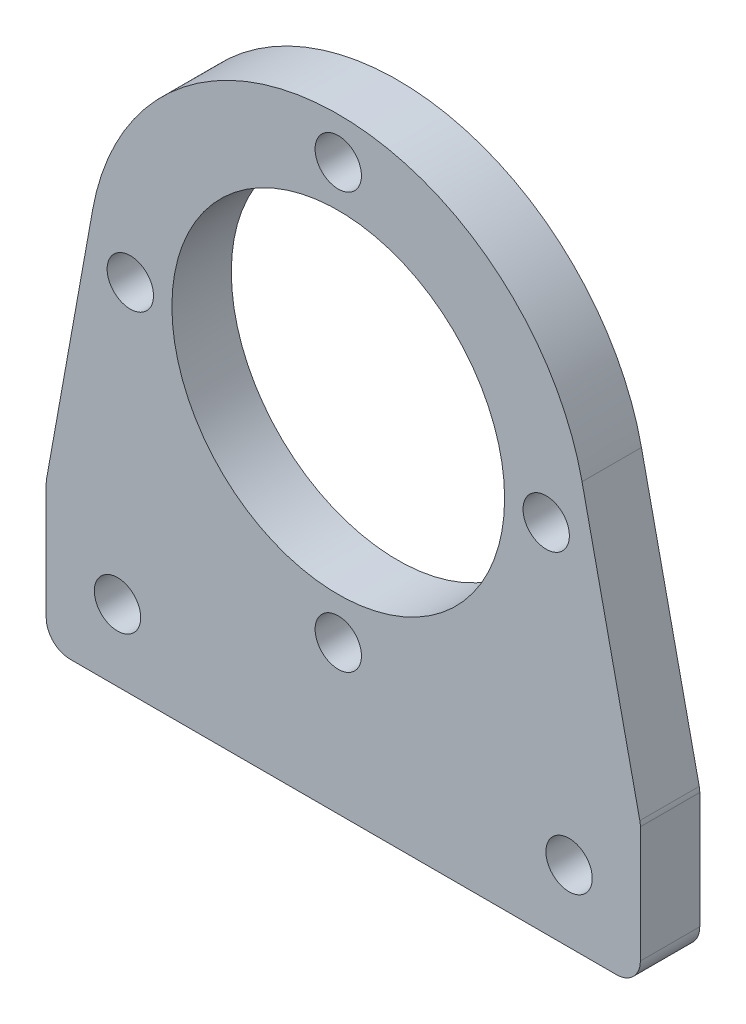
ISO-10303-21;
HEADER;
FILE_DESCRIPTION(('STEP AP214'),'2;1');
FILE_NAME('part.step','',(''),(''),'','','');
FILE_SCHEMA(('AUTOMOTIVE_DESIGN { 1 0 10303 214 1 1 1 1 }'));
ENDSEC;
DATA;
#1=APPLICATION_CONTEXT('core data for automotive mechanical design processes');
#2=APPLICATION_PROTOCOL_DEFINITION('international standard','automotive_design',2000,#1);
#3=PRODUCT_CONTEXT('',#1,'mechanical');
#4=PRODUCT('Part','Part','',(#3));
#5=PRODUCT_RELATED_PRODUCT_CATEGORY('part','',(#4));
#6=PRODUCT_DEFINITION_FORMATION('','',#4);
#7=PRODUCT_DEFINITION_CONTEXT('part definition',#1,'design');
#8=PRODUCT_DEFINITION('design','',#6,#7);
#9=PRODUCT_DEFINITION_SHAPE('','',#8);
#10=(LENGTH_UNIT() NAMED_UNIT(*) SI_UNIT(.MILLI.,.METRE.));
#11=(NAMED_UNIT(*) PLANE_ANGLE_UNIT() SI_UNIT($,.RADIAN.));
#12=(NAMED_UNIT(*) SI_UNIT($,.STERADIAN.) SOLID_ANGLE_UNIT());
#13=UNCERTAINTY_MEASURE_WITH_UNIT(LENGTH_MEASURE(1.E-05),#10,'distance_accuracy_value','');
#14=(GEOMETRIC_REPRESENTATION_CONTEXT(3) GLOBAL_UNCERTAINTY_ASSIGNED_CONTEXT((#13)) GLOBAL_UNIT_ASSIGNED_CONTEXT((#10,
#11,#12)) REPRESENTATION_CONTEXT('',''));
#15=CARTESIAN_POINT('',(0.,0.,0.));
#16=DIRECTION('',(0.,0.,1.));
#17=DIRECTION('',(1.,0.,0.));
#18=AXIS2_PLACEMENT_3D('',#15,#16,#17);
#19=CARTESIAN_POINT('',(0.,0.,5.));
#20=DIRECTION('',(0.,0.,1.));
#21=DIRECTION('',(1.,0.,0.));
#22=AXIS2_PLACEMENT_3D('',#19,#20,#21);
#23=PLANE('',#22);
#24=CARTESIAN_POINT('',(19.4243190206416,-24.,5.));
#25=DIRECTION('',(0.,0.,1.));
#26=DIRECTION('',(1.,0.,0.));
#27=AXIS2_PLACEMENT_3D('',#24,#25,#26);
#28=CIRCLE('',#27,1.95);
#29=CARTESIAN_POINT('',(21.3743190206416,-24.,5.));
#30=VERTEX_POINT('',#29);
#31=EDGE_CURVE('E250',#30,#30,#28,.T.);
#32=ORIENTED_EDGE('',*,*,#31,.F.);
#33=EDGE_LOOP('',(#32));
#34=FACE_BOUND('',#33,.T.);
#35=CARTESIAN_POINT('',(-18.5756809793584,-24.,5.));
#36=DIRECTION('',(0.,0.,1.));
#37=DIRECTION('',(1.,0.,0.));
#38=AXIS2_PLACEMENT_3D('',#35,#36,#37);
#39=CIRCLE('',#38,1.95);
#40=CARTESIAN_POINT('',(-16.6256809793584,-24.,5.));
#41=VERTEX_POINT('',#40);
#42=EDGE_CURVE('E247',#41,#41,#39,.T.);
#43=ORIENTED_EDGE('',*,*,#42,.F.);
#44=EDGE_LOOP('',(#43));
#45=FACE_BOUND('',#44,.T.);
#46=CARTESIAN_POINT('',(0.,-17.5,5.));
#47=DIRECTION('',(0.,0.,1.));
#48=DIRECTION('',(1.,0.,0.));
#49=AXIS2_PLACEMENT_3D('',#46,#47,#48);
#50=CIRCLE('',#49,1.95);
#51=CARTESIAN_POINT('',(1.95,-17.5,5.));
#52=VERTEX_POINT('',#51);
#53=EDGE_CURVE('E229',#52,#52,#50,.T.);
#54=ORIENTED_EDGE('',*,*,#53,.F.);
#55=EDGE_LOOP('',(#54));
#56=FACE_BOUND('',#55,.T.);
#57=CARTESIAN_POINT('',(0.,0.,5.));
#58=DIRECTION('',(0.,0.,1.));
#59=DIRECTION('',(1.,0.,0.));
#60=AXIS2_PLACEMENT_3D('',#57,#58,#59);
#61=CIRCLE('',#60,14.);
#62=CARTESIAN_POINT('',(14.,0.,5.));
#63=VERTEX_POINT('',#62);
#64=EDGE_CURVE('E218',#63,#63,#61,.T.);
#65=ORIENTED_EDGE('',*,*,#64,.F.);
#66=EDGE_LOOP('',(#65));
#67=FACE_BOUND('',#66,.T.);
#68=DIRECTION('',(0.,1.,0.));
#69=VECTOR('',#68,1.);
#70=CARTESIAN_POINT('',(25.4243190206416,-30.,5.));
#71=LINE('',#70,#69);
#72=CARTESIAN_POINT('',(25.4243190206416,-28.,5.));
#73=VERTEX_POINT('',#72);
#74=CARTESIAN_POINT('',(25.4243190206416,-18.2157751428587,5.));
#75=VERTEX_POINT('',#74);
#76=EDGE_CURVE('E214',#73,#75,#71,.T.);
#77=ORIENTED_EDGE('',*,*,#76,.T.);
#78=CARTESIAN_POINT('',(23.4243190206416,-18.2157751428587,5.));
#79=DIRECTION('',(0.,0.,1.));
#80=DIRECTION('',(1.,0.,0.));
#81=AXIS2_PLACEMENT_3D('',#78,#79,#80);
#82=CIRCLE('',#81,2.);
#83=CARTESIAN_POINT('',(25.3782958060684,-17.789190189991,5.));
#84=VERTEX_POINT('',#83);
#85=EDGE_CURVE('E168',#75,#84,#82,.T.);
#86=ORIENTED_EDGE('',*,*,#85,.T.);
#87=DIRECTION('',(-0.213292476433854,0.976988392713401,0.));
#88=VECTOR('',#87,1.);
#89=CARTESIAN_POINT('',(25.4243190206416,-18.,5.));
#90=LINE('',#89,#88);
#91=CARTESIAN_POINT('',(20.5167562469814,4.47914200511093,5.));
#92=VERTEX_POINT('',#91);
#93=EDGE_CURVE('E133',#84,#92,#90,.T.);
#94=ORIENTED_EDGE('',*,*,#93,.T.);
#95=CARTESIAN_POINT('',(0.,0.,5.));
#96=DIRECTION('',(0.,0.,1.));
#97=DIRECTION('',(1.,0.,0.));
#98=AXIS2_PLACEMENT_3D('',#95,#96,#97);
#99=CIRCLE('',#98,21.);
#100=CARTESIAN_POINT('',(-20.6681495660831,3.7185472316512,5.));
#101=VERTEX_POINT('',#100);
#102=EDGE_CURVE('E127',#92,#101,#99,.T.);
#103=ORIENTED_EDGE('',*,*,#102,.T.);
#104=DIRECTION('',(-0.177073677697676,-0.984197598384907,0.));
#105=VECTOR('',#104,1.);
#106=CARTESIAN_POINT('',(-20.6681495660831,3.7185472316512,5.));
#107=LINE('',#106,#105);
#108=CARTESIAN_POINT('',(-24.5440761761282,-17.8243365595553,5.));
#109=VERTEX_POINT('',#108);
#110=EDGE_CURVE('E117',#101,#109,#107,.T.);
#111=ORIENTED_EDGE('',*,*,#110,.T.);
#112=CARTESIAN_POINT('',(-22.5756809793584,-18.1784839149506,5.));
#113=DIRECTION('',(0.,0.,1.));
#114=DIRECTION('',(1.,0.,0.));
#115=AXIS2_PLACEMENT_3D('',#112,#113,#114);
#116=CIRCLE('',#115,2.);
#117=CARTESIAN_POINT('',(-24.5756809793584,-18.1784839149506,5.));
#118=VERTEX_POINT('',#117);
#119=EDGE_CURVE('E163',#109,#118,#116,.T.);
#120=ORIENTED_EDGE('',*,*,#119,.T.);
#121=DIRECTION('',(0.,-1.,0.));
#122=VECTOR('',#121,1.);
#123=CARTESIAN_POINT('',(-24.5756809793584,-18.,5.));
#124=LINE('',#123,#122);
#125=CARTESIAN_POINT('',(-24.5756809793584,-28.,5.));
#126=VERTEX_POINT('',#125);
#127=EDGE_CURVE('E126',#118,#126,#124,.T.);
#128=ORIENTED_EDGE('',*,*,#127,.T.);
#129=CARTESIAN_POINT('',(-22.5756809793584,-28.,5.));
#130=DIRECTION('',(0.,0.,1.));
#131=DIRECTION('',(1.,0.,0.));
#132=AXIS2_PLACEMENT_3D('',#129,#130,#131);
#133=CIRCLE('',#132,2.);
#134=CARTESIAN_POINT('',(-22.5756809793584,-30.,5.));
#135=VERTEX_POINT('',#134);
#136=EDGE_CURVE('E61',#126,#135,#133,.T.);
#137=ORIENTED_EDGE('',*,*,#136,.T.);
#138=DIRECTION('',(1.,0.,0.));
#139=VECTOR('',#138,1.);
#140=CARTESIAN_POINT('',(-24.5756809793584,-30.,5.));
#141=LINE('',#140,#139);
#142=CARTESIAN_POINT('',(23.4243190206416,-30.,5.));
#143=VERTEX_POINT('',#142);
#144=EDGE_CURVE('E185',#135,#143,#141,.T.);
#145=ORIENTED_EDGE('',*,*,#144,.T.);
#146=CARTESIAN_POINT('',(23.4243190206416,-28.,5.));
#147=DIRECTION('',(0.,0.,1.));
#148=DIRECTION('',(1.,0.,0.));
#149=AXIS2_PLACEMENT_3D('',#146,#147,#148);
#150=CIRCLE('',#149,2.);
#151=EDGE_CURVE('E166',#143,#73,#150,.T.);
#152=ORIENTED_EDGE('',*,*,#151,.T.);
#153=EDGE_LOOP('',(#77,#86,#94,#103,#111,#120,#128,#137,#145,#152));
#154=FACE_BOUND('',#153,.T.);
#155=CARTESIAN_POINT('',(0.,17.5,5.));
#156=DIRECTION('',(0.,0.,1.));
#157=DIRECTION('',(1.,0.,0.));
#158=AXIS2_PLACEMENT_3D('',#155,#156,#157);
#159=CIRCLE('',#158,1.95);
#160=CARTESIAN_POINT('',(1.95,17.5,5.));
#161=VERTEX_POINT('',#160);
#162=EDGE_CURVE('E207',#161,#161,#159,.T.);
#163=ORIENTED_EDGE('',*,*,#162,.F.);
#164=EDGE_LOOP('',(#163));
#165=FACE_BOUND('',#164,.T.);
#166=CARTESIAN_POINT('',(17.5,0.,5.));
#167=DIRECTION('',(0.,0.,1.));
#168=DIRECTION('',(1.,0.,0.));
#169=AXIS2_PLACEMENT_3D('',#166,#167,#168);
#170=CIRCLE('',#169,1.95);
#171=CARTESIAN_POINT('',(19.45,0.,5.));
#172=VERTEX_POINT('',#171);
#173=EDGE_CURVE('E223',#172,#172,#170,.T.);
#174=ORIENTED_EDGE('',*,*,#173,.F.);
#175=EDGE_LOOP('',(#174));
#176=FACE_BOUND('',#175,.T.);
#177=CARTESIAN_POINT('',(-17.5,0.,5.));
#178=DIRECTION('',(0.,0.,1.));
#179=DIRECTION('',(1.,0.,0.));
#180=AXIS2_PLACEMENT_3D('',#177,#178,#179);
#181=CIRCLE('',#180,1.95);
#182=CARTESIAN_POINT('',(-15.55,0.,5.));
#183=VERTEX_POINT('',#182);
#184=EDGE_CURVE('E235',#183,#183,#181,.T.);
#185=ORIENTED_EDGE('',*,*,#184,.F.);
#186=EDGE_LOOP('',(#185));
#187=FACE_BOUND('',#186,.T.);
#188=ADVANCED_FACE('F39',(#34,#45,#56,#67,#154,#165,#176,#187),#23,.T.);
#189=CARTESIAN_POINT('',(0.,0.,0.));
#190=DIRECTION('',(0.,0.,1.));
#191=DIRECTION('',(1.,0.,0.));
#192=AXIS2_PLACEMENT_3D('',#189,#190,#191);
#193=PLANE('',#192);
#194=CARTESIAN_POINT('',(19.4243190206416,-24.,0.));
#195=DIRECTION('',(0.,0.,1.));
#196=DIRECTION('',(1.,0.,0.));
#197=AXIS2_PLACEMENT_3D('',#194,#195,#196);
#198=CIRCLE('',#197,1.95);
#199=CARTESIAN_POINT('',(21.3743190206416,-24.,0.));
#200=VERTEX_POINT('',#199);
#201=EDGE_CURVE('E241',#200,#200,#198,.T.);
#202=ORIENTED_EDGE('',*,*,#201,.T.);
#203=EDGE_LOOP('',(#202));
#204=FACE_BOUND('',#203,.T.);
#205=CARTESIAN_POINT('',(-18.5756809793584,-24.,0.));
#206=DIRECTION('',(0.,0.,1.));
#207=DIRECTION('',(1.,0.,0.));
#208=AXIS2_PLACEMENT_3D('',#205,#206,#207);
#209=CIRCLE('',#208,1.95);
#210=CARTESIAN_POINT('',(-16.6256809793584,-24.,0.));
#211=VERTEX_POINT('',#210);
#212=EDGE_CURVE('E244',#211,#211,#209,.T.);
#213=ORIENTED_EDGE('',*,*,#212,.T.);
#214=EDGE_LOOP('',(#213));
#215=FACE_BOUND('',#214,.T.);
#216=DIRECTION('',(-0.213292476433854,0.976988392713401,0.));
#217=VECTOR('',#216,1.);
#218=CARTESIAN_POINT('',(25.4243190206416,-18.,0.));
#219=LINE('',#218,#217);
#220=CARTESIAN_POINT('',(25.3782958060684,-17.789190189991,0.));
#221=VERTEX_POINT('',#220);
#222=CARTESIAN_POINT('',(20.5167562469814,4.47914200511093,0.));
#223=VERTEX_POINT('',#222);
#224=EDGE_CURVE('E137',#221,#223,#219,.T.);
#225=ORIENTED_EDGE('',*,*,#224,.F.);
#226=CARTESIAN_POINT('',(23.4243190206416,-18.2157751428587,0.));
#227=DIRECTION('',(0.,0.,1.));
#228=DIRECTION('',(1.,0.,0.));
#229=AXIS2_PLACEMENT_3D('',#226,#227,#228);
#230=CIRCLE('',#229,2.);
#231=CARTESIAN_POINT('',(25.4243190206416,-18.2157751428587,0.));
#232=VERTEX_POINT('',#231);
#233=EDGE_CURVE('E156',#221,#232,#230,.F.);
#234=ORIENTED_EDGE('',*,*,#233,.T.);
#235=DIRECTION('',(0.,1.,0.));
#236=VECTOR('',#235,1.);
#237=CARTESIAN_POINT('',(25.4243190206416,-30.,0.));
#238=LINE('',#237,#236);
#239=CARTESIAN_POINT('',(25.4243190206416,-28.,0.));
#240=VERTEX_POINT('',#239);
#241=EDGE_CURVE('E197',#240,#232,#238,.T.);
#242=ORIENTED_EDGE('',*,*,#241,.F.);
#243=CARTESIAN_POINT('',(23.4243190206416,-28.,0.));
#244=DIRECTION('',(0.,0.,1.));
#245=DIRECTION('',(1.,0.,0.));
#246=AXIS2_PLACEMENT_3D('',#243,#244,#245);
#247=CIRCLE('',#246,2.);
#248=CARTESIAN_POINT('',(23.4243190206416,-30.,0.));
#249=VERTEX_POINT('',#248);
#250=EDGE_CURVE('E154',#240,#249,#247,.F.);
#251=ORIENTED_EDGE('',*,*,#250,.T.);
#252=DIRECTION('',(1.,0.,0.));
#253=VECTOR('',#252,1.);
#254=CARTESIAN_POINT('',(-24.5756809793584,-30.,0.));
#255=LINE('',#254,#253);
#256=CARTESIAN_POINT('',(-22.5756809793584,-30.,0.));
#257=VERTEX_POINT('',#256);
#258=EDGE_CURVE('E191',#257,#249,#255,.T.);
#259=ORIENTED_EDGE('',*,*,#258,.F.);
#260=CARTESIAN_POINT('',(-22.5756809793584,-28.,0.));
#261=DIRECTION('',(0.,0.,1.));
#262=DIRECTION('',(1.,0.,0.));
#263=AXIS2_PLACEMENT_3D('',#260,#261,#262);
#264=CIRCLE('',#263,2.);
#265=CARTESIAN_POINT('',(-24.5756809793584,-28.,0.));
#266=VERTEX_POINT('',#265);
#267=EDGE_CURVE('E152',#257,#266,#264,.F.);
#268=ORIENTED_EDGE('',*,*,#267,.T.);
#269=DIRECTION('',(0.,-1.,0.));
#270=VECTOR('',#269,1.);
#271=CARTESIAN_POINT('',(-24.5756809793584,-18.,0.));
#272=LINE('',#271,#270);
#273=CARTESIAN_POINT('',(-24.5756809793584,-18.1784839149506,0.));
#274=VERTEX_POINT('',#273);
#275=EDGE_CURVE('E183',#274,#266,#272,.T.);
#276=ORIENTED_EDGE('',*,*,#275,.F.);
#277=CARTESIAN_POINT('',(-22.5756809793584,-18.1784839149506,0.));
#278=DIRECTION('',(0.,0.,1.));
#279=DIRECTION('',(1.,0.,0.));
#280=AXIS2_PLACEMENT_3D('',#277,#278,#279);
#281=CIRCLE('',#280,2.);
#282=CARTESIAN_POINT('',(-24.5440761761282,-17.8243365595553,0.));
#283=VERTEX_POINT('',#282);
#284=EDGE_CURVE('E146',#274,#283,#281,.F.);
#285=ORIENTED_EDGE('',*,*,#284,.T.);
#286=DIRECTION('',(-0.177073677697676,-0.984197598384907,0.));
#287=VECTOR('',#286,1.);
#288=CARTESIAN_POINT('',(-20.6681495660831,3.7185472316512,0.));
#289=LINE('',#288,#287);
#290=CARTESIAN_POINT('',(-20.6681495660831,3.7185472316512,0.));
#291=VERTEX_POINT('',#290);
#292=EDGE_CURVE('E201',#291,#283,#289,.T.);
#293=ORIENTED_EDGE('',*,*,#292,.F.);
#294=CARTESIAN_POINT('',(0.,0.,0.));
#295=DIRECTION('',(0.,0.,1.));
#296=DIRECTION('',(1.,0.,0.));
#297=AXIS2_PLACEMENT_3D('',#294,#295,#296);
#298=CIRCLE('',#297,21.);
#299=EDGE_CURVE('E141',#223,#291,#298,.T.);
#300=ORIENTED_EDGE('',*,*,#299,.F.);
#301=EDGE_LOOP('',(#225,#234,#242,#251,#259,#268,#276,#285,#293,#300));
#302=FACE_BOUND('',#301,.T.);
#303=CARTESIAN_POINT('',(0.,17.5,0.));
#304=DIRECTION('',(0.,0.,1.));
#305=DIRECTION('',(1.,0.,0.));
#306=AXIS2_PLACEMENT_3D('',#303,#304,#305);
#307=CIRCLE('',#306,1.95);
#308=CARTESIAN_POINT('',(1.95,17.5,0.));
#309=VERTEX_POINT('',#308);
#310=EDGE_CURVE('E210',#309,#309,#307,.T.);
#311=ORIENTED_EDGE('',*,*,#310,.T.);
#312=EDGE_LOOP('',(#311));
#313=FACE_BOUND('',#312,.T.);
#314=CARTESIAN_POINT('',(0.,0.,0.));
#315=DIRECTION('',(0.,0.,1.));
#316=DIRECTION('',(1.,0.,0.));
#317=AXIS2_PLACEMENT_3D('',#314,#315,#316);
#318=CIRCLE('',#317,14.);
#319=CARTESIAN_POINT('',(14.,0.,0.));
#320=VERTEX_POINT('',#319);
#321=EDGE_CURVE('E220',#320,#320,#318,.T.);
#322=ORIENTED_EDGE('',*,*,#321,.T.);
#323=EDGE_LOOP('',(#322));
#324=FACE_BOUND('',#323,.T.);
#325=CARTESIAN_POINT('',(17.5,0.,0.));
#326=DIRECTION('',(0.,0.,1.));
#327=DIRECTION('',(1.,0.,0.));
#328=AXIS2_PLACEMENT_3D('',#325,#326,#327);
#329=CIRCLE('',#328,1.95);
#330=CARTESIAN_POINT('',(19.45,0.,0.));
#331=VERTEX_POINT('',#330);
#332=EDGE_CURVE('E226',#331,#331,#329,.T.);
#333=ORIENTED_EDGE('',*,*,#332,.T.);
#334=EDGE_LOOP('',(#333));
#335=FACE_BOUND('',#334,.T.);
#336=CARTESIAN_POINT('',(0.,-17.5,0.));
#337=DIRECTION('',(0.,0.,1.));
#338=DIRECTION('',(1.,0.,0.));
#339=AXIS2_PLACEMENT_3D('',#336,#337,#338);
#340=CIRCLE('',#339,1.95);
#341=CARTESIAN_POINT('',(1.95,-17.5,0.));
#342=VERTEX_POINT('',#341);
#343=EDGE_CURVE('E232',#342,#342,#340,.T.);
#344=ORIENTED_EDGE('',*,*,#343,.T.);
#345=EDGE_LOOP('',(#344));
#346=FACE_BOUND('',#345,.T.);
#347=CARTESIAN_POINT('',(-17.5,0.,0.));
#348=DIRECTION('',(0.,0.,1.));
#349=DIRECTION('',(1.,0.,0.));
#350=AXIS2_PLACEMENT_3D('',#347,#348,#349);
#351=CIRCLE('',#350,1.95);
#352=CARTESIAN_POINT('',(-15.55,0.,0.));
#353=VERTEX_POINT('',#352);
#354=EDGE_CURVE('E238',#353,#353,#351,.T.);
#355=ORIENTED_EDGE('',*,*,#354,.T.);
#356=EDGE_LOOP('',(#355));
#357=FACE_BOUND('',#356,.T.);
#358=ADVANCED_FACE('F194',(#204,#215,#302,#313,#324,#335,#346,#357),#193,.F.);
#359=CARTESIAN_POINT('',(0.,0.,5.));
#360=DIRECTION('',(0.,0.,-1.));
#361=DIRECTION('',(-1.,0.,0.));
#362=AXIS2_PLACEMENT_3D('',#359,#360,#361);
#363=CYLINDRICAL_SURFACE('',#362,21.);
#364=ORIENTED_EDGE('',*,*,#299,.T.);
#365=DIRECTION('',(0.,0.,-1.));
#366=VECTOR('',#365,1.);
#367=CARTESIAN_POINT('',(-20.6681495660831,3.7185472316512,5.));
#368=LINE('',#367,#366);
#369=EDGE_CURVE('E122',#101,#291,#368,.T.);
#370=ORIENTED_EDGE('',*,*,#369,.F.);
#371=ORIENTED_EDGE('',*,*,#102,.F.);
#372=DIRECTION('',(0.,0.,-1.));
#373=VECTOR('',#372,1.);
#374=CARTESIAN_POINT('',(20.5167562469814,4.47914200511093,5.));
#375=LINE('',#374,#373);
#376=EDGE_CURVE('E143',#92,#223,#375,.T.);
#377=ORIENTED_EDGE('',*,*,#376,.T.);
#378=EDGE_LOOP('',(#364,#370,#371,#377));
#379=FACE_BOUND('',#378,.T.);
#380=ADVANCED_FACE('F139',(#379),#363,.T.);
#381=CARTESIAN_POINT('',(-20.6681495660831,3.7185472316512,5.));
#382=DIRECTION('',(0.984197598384907,-0.177073677697676,0.));
#383=DIRECTION('',(0.177073677697676,0.984197598384907,0.));
#384=AXIS2_PLACEMENT_3D('',#381,#382,#383);
#385=PLANE('',#384);
#386=ORIENTED_EDGE('',*,*,#292,.T.);
#387=DIRECTION('',(0.,0.,-1.));
#388=VECTOR('',#387,1.);
#389=CARTESIAN_POINT('',(-24.5440761761282,-17.8243365595553,5.));
#390=LINE('',#389,#388);
#391=EDGE_CURVE('E11',#283,#109,#390,.F.);
#392=ORIENTED_EDGE('',*,*,#391,.T.);
#393=ORIENTED_EDGE('',*,*,#110,.F.);
#394=ORIENTED_EDGE('',*,*,#369,.T.);
#395=EDGE_LOOP('',(#386,#392,#393,#394));
#396=FACE_BOUND('',#395,.T.);
#397=ADVANCED_FACE('F120',(#396),#385,.F.);
#398=CARTESIAN_POINT('',(-24.5756809793584,-18.,5.));
#399=DIRECTION('',(1.,0.,0.));
#400=DIRECTION('',(0.,1.,0.));
#401=AXIS2_PLACEMENT_3D('',#398,#399,#400);
#402=PLANE('',#401);
#403=ORIENTED_EDGE('',*,*,#275,.T.);
#404=DIRECTION('',(0.,0.,-1.));
#405=VECTOR('',#404,1.);
#406=CARTESIAN_POINT('',(-24.5756809793584,-28.,5.));
#407=LINE('',#406,#405);
#408=EDGE_CURVE('E47',#266,#126,#407,.F.);
#409=ORIENTED_EDGE('',*,*,#408,.T.);
#410=ORIENTED_EDGE('',*,*,#127,.F.);
#411=DIRECTION('',(0.,0.,-1.));
#412=VECTOR('',#411,1.);
#413=CARTESIAN_POINT('',(-24.5756809793584,-18.1784839149506,5.));
#414=LINE('',#413,#412);
#415=EDGE_CURVE('E174',#118,#274,#414,.T.);
#416=ORIENTED_EDGE('',*,*,#415,.T.);
#417=EDGE_LOOP('',(#403,#409,#410,#416));
#418=FACE_BOUND('',#417,.T.);
#419=ADVANCED_FACE('F180',(#418),#402,.F.);
#420=CARTESIAN_POINT('',(-24.5756809793584,-30.,5.));
#421=DIRECTION('',(0.,1.,0.));
#422=DIRECTION('',(0.,0.,1.));
#423=AXIS2_PLACEMENT_3D('',#420,#421,#422);
#424=PLANE('',#423);
#425=ORIENTED_EDGE('',*,*,#258,.T.);
#426=DIRECTION('',(0.,0.,-1.));
#427=VECTOR('',#426,1.);
#428=CARTESIAN_POINT('',(23.4243190206416,-30.,5.));
#429=LINE('',#428,#427);
#430=EDGE_CURVE('E54',#249,#143,#429,.F.);
#431=ORIENTED_EDGE('',*,*,#430,.T.);
#432=ORIENTED_EDGE('',*,*,#144,.F.);
#433=DIRECTION('',(0.,0.,-1.));
#434=VECTOR('',#433,1.);
#435=CARTESIAN_POINT('',(-22.5756809793584,-30.,5.));
#436=LINE('',#435,#434);
#437=EDGE_CURVE('E170',#135,#257,#436,.T.);
#438=ORIENTED_EDGE('',*,*,#437,.T.);
#439=EDGE_LOOP('',(#425,#431,#432,#438));
#440=FACE_BOUND('',#439,.T.);
#441=ADVANCED_FACE('F190',(#440),#424,.F.);
#442=CARTESIAN_POINT('',(25.4243190206416,-30.,5.));
#443=DIRECTION('',(-1.,0.,0.));
#444=DIRECTION('',(0.,-1.,0.));
#445=AXIS2_PLACEMENT_3D('',#442,#443,#444);
#446=PLANE('',#445);
#447=ORIENTED_EDGE('',*,*,#241,.T.);
#448=DIRECTION('',(0.,0.,-1.));
#449=VECTOR('',#448,1.);
#450=CARTESIAN_POINT('',(25.4243190206416,-18.2157751428587,5.));
#451=LINE('',#450,#449);
#452=EDGE_CURVE('E161',#232,#75,#451,.F.);
#453=ORIENTED_EDGE('',*,*,#452,.T.);
#454=ORIENTED_EDGE('',*,*,#76,.F.);
#455=DIRECTION('',(0.,0.,-1.));
#456=VECTOR('',#455,1.);
#457=CARTESIAN_POINT('',(25.4243190206416,-28.,5.));
#458=LINE('',#457,#456);
#459=EDGE_CURVE('E158',#73,#240,#458,.T.);
#460=ORIENTED_EDGE('',*,*,#459,.T.);
#461=EDGE_LOOP('',(#447,#453,#454,#460));
#462=FACE_BOUND('',#461,.T.);
#463=ADVANCED_FACE('F314',(#462),#446,.F.);
#464=CARTESIAN_POINT('',(25.4243190206416,-18.,5.));
#465=DIRECTION('',(-0.976988392713401,-0.213292476433854,0.));
#466=DIRECTION('',(0.213292476433854,-0.976988392713401,0.));
#467=AXIS2_PLACEMENT_3D('',#464,#465,#466);
#468=PLANE('',#467);
#469=ORIENTED_EDGE('',*,*,#93,.F.);
#470=DIRECTION('',(0.,0.,-1.));
#471=VECTOR('',#470,1.);
#472=CARTESIAN_POINT('',(25.3782958060684,-17.789190189991,5.));
#473=LINE('',#472,#471);
#474=EDGE_CURVE('E142',#84,#221,#473,.T.);
#475=ORIENTED_EDGE('',*,*,#474,.T.);
#476=ORIENTED_EDGE('',*,*,#224,.T.);
#477=ORIENTED_EDGE('',*,*,#376,.F.);
#478=EDGE_LOOP('',(#469,#475,#476,#477));
#479=FACE_BOUND('',#478,.T.);
#480=ADVANCED_FACE('F205',(#479),#468,.F.);
#481=CARTESIAN_POINT('',(0.,17.5,5.));
#482=DIRECTION('',(0.,0.,-1.));
#483=DIRECTION('',(-1.,0.,0.));
#484=AXIS2_PLACEMENT_3D('',#481,#482,#483);
#485=CYLINDRICAL_SURFACE('',#484,1.95);
#486=ORIENTED_EDGE('',*,*,#162,.T.);
#487=EDGE_LOOP('',(#486));
#488=FACE_BOUND('',#487,.T.);
#489=ORIENTED_EDGE('',*,*,#310,.F.);
#490=EDGE_LOOP('',(#489));
#491=FACE_BOUND('',#490,.T.);
#492=ADVANCED_FACE('F279',(#488,#491),#485,.F.);
#493=CARTESIAN_POINT('',(0.,0.,5.));
#494=DIRECTION('',(0.,0.,-1.));
#495=DIRECTION('',(-1.,0.,0.));
#496=AXIS2_PLACEMENT_3D('',#493,#494,#495);
#497=CYLINDRICAL_SURFACE('',#496,14.);
#498=ORIENTED_EDGE('',*,*,#64,.T.);
#499=EDGE_LOOP('',(#498));
#500=FACE_BOUND('',#499,.T.);
#501=ORIENTED_EDGE('',*,*,#321,.F.);
#502=EDGE_LOOP('',(#501));
#503=FACE_BOUND('',#502,.T.);
#504=ADVANCED_FACE('F275',(#500,#503),#497,.F.);
#505=CARTESIAN_POINT('',(17.5,0.,5.));
#506=DIRECTION('',(0.,0.,-1.));
#507=DIRECTION('',(-1.,0.,0.));
#508=AXIS2_PLACEMENT_3D('',#505,#506,#507);
#509=CYLINDRICAL_SURFACE('',#508,1.95);
#510=ORIENTED_EDGE('',*,*,#173,.T.);
#511=EDGE_LOOP('',(#510));
#512=FACE_BOUND('',#511,.T.);
#513=ORIENTED_EDGE('',*,*,#332,.F.);
#514=EDGE_LOOP('',(#513));
#515=FACE_BOUND('',#514,.T.);
#516=ADVANCED_FACE('F278',(#512,#515),#509,.F.);
#517=CARTESIAN_POINT('',(0.,-17.5,5.));
#518=DIRECTION('',(0.,0.,-1.));
#519=DIRECTION('',(-1.,0.,0.));
#520=AXIS2_PLACEMENT_3D('',#517,#518,#519);
#521=CYLINDRICAL_SURFACE('',#520,1.95);
#522=ORIENTED_EDGE('',*,*,#53,.T.);
#523=EDGE_LOOP('',(#522));
#524=FACE_BOUND('',#523,.T.);
#525=ORIENTED_EDGE('',*,*,#343,.F.);
#526=EDGE_LOOP('',(#525));
#527=FACE_BOUND('',#526,.T.);
#528=ADVANCED_FACE('F294',(#524,#527),#521,.F.);
#529=CARTESIAN_POINT('',(-17.5,0.,5.));
#530=DIRECTION('',(0.,0.,-1.));
#531=DIRECTION('',(-1.,0.,0.));
#532=AXIS2_PLACEMENT_3D('',#529,#530,#531);
#533=CYLINDRICAL_SURFACE('',#532,1.95);
#534=ORIENTED_EDGE('',*,*,#184,.T.);
#535=EDGE_LOOP('',(#534));
#536=FACE_BOUND('',#535,.T.);
#537=ORIENTED_EDGE('',*,*,#354,.F.);
#538=EDGE_LOOP('',(#537));
#539=FACE_BOUND('',#538,.T.);
#540=ADVANCED_FACE('F292',(#536,#539),#533,.F.);
#541=CARTESIAN_POINT('',(-18.5756809793584,-24.,0.));
#542=DIRECTION('',(0.,0.,1.));
#543=DIRECTION('',(1.,0.,0.));
#544=AXIS2_PLACEMENT_3D('',#541,#542,#543);
#545=CYLINDRICAL_SURFACE('',#544,1.95);
#546=ORIENTED_EDGE('',*,*,#212,.F.);
#547=EDGE_LOOP('',(#546));
#548=FACE_BOUND('',#547,.T.);
#549=ORIENTED_EDGE('',*,*,#42,.T.);
#550=EDGE_LOOP('',(#549));
#551=FACE_BOUND('',#550,.T.);
#552=ADVANCED_FACE('F262',(#548,#551),#545,.F.);
#553=CARTESIAN_POINT('',(19.4243190206416,-24.,0.));
#554=DIRECTION('',(0.,0.,1.));
#555=DIRECTION('',(1.,0.,0.));
#556=AXIS2_PLACEMENT_3D('',#553,#554,#555);
#557=CYLINDRICAL_SURFACE('',#556,1.95);
#558=ORIENTED_EDGE('',*,*,#201,.F.);
#559=EDGE_LOOP('',(#558));
#560=FACE_BOUND('',#559,.T.);
#561=ORIENTED_EDGE('',*,*,#31,.T.);
#562=EDGE_LOOP('',(#561));
#563=FACE_BOUND('',#562,.T.);
#564=ADVANCED_FACE('F258',(#560,#563),#557,.F.);
#565=CARTESIAN_POINT('',(23.4243190206416,-18.2157751428587,5.));
#566=DIRECTION('',(0.,0.,-1.));
#567=DIRECTION('',(-1.,0.,0.));
#568=AXIS2_PLACEMENT_3D('',#565,#566,#567);
#569=CYLINDRICAL_SURFACE('',#568,2.);
#570=ORIENTED_EDGE('',*,*,#85,.F.);
#571=ORIENTED_EDGE('',*,*,#452,.F.);
#572=ORIENTED_EDGE('',*,*,#233,.F.);
#573=ORIENTED_EDGE('',*,*,#474,.F.);
#574=EDGE_LOOP('',(#570,#571,#572,#573));
#575=FACE_BOUND('',#574,.T.);
#576=ADVANCED_FACE('F261',(#575),#569,.T.);
#577=CARTESIAN_POINT('',(23.4243190206416,-28.,5.));
#578=DIRECTION('',(0.,0.,-1.));
#579=DIRECTION('',(-1.,0.,0.));
#580=AXIS2_PLACEMENT_3D('',#577,#578,#579);
#581=CYLINDRICAL_SURFACE('',#580,2.);
#582=ORIENTED_EDGE('',*,*,#151,.F.);
#583=ORIENTED_EDGE('',*,*,#430,.F.);
#584=ORIENTED_EDGE('',*,*,#250,.F.);
#585=ORIENTED_EDGE('',*,*,#459,.F.);
#586=EDGE_LOOP('',(#582,#583,#584,#585));
#587=FACE_BOUND('',#586,.T.);
#588=ADVANCED_FACE('F328',(#587),#581,.T.);
#589=CARTESIAN_POINT('',(-22.5756809793584,-28.,5.));
#590=DIRECTION('',(0.,0.,-1.));
#591=DIRECTION('',(-1.,0.,0.));
#592=AXIS2_PLACEMENT_3D('',#589,#590,#591);
#593=CYLINDRICAL_SURFACE('',#592,2.);
#594=ORIENTED_EDGE('',*,*,#136,.F.);
#595=ORIENTED_EDGE('',*,*,#408,.F.);
#596=ORIENTED_EDGE('',*,*,#267,.F.);
#597=ORIENTED_EDGE('',*,*,#437,.F.);
#598=EDGE_LOOP('',(#594,#595,#596,#597));
#599=FACE_BOUND('',#598,.T.);
#600=ADVANCED_FACE('F188',(#599),#593,.T.);
#601=CARTESIAN_POINT('',(-22.5756809793584,-18.1784839149506,5.));
#602=DIRECTION('',(0.,0.,-1.));
#603=DIRECTION('',(-1.,0.,0.));
#604=AXIS2_PLACEMENT_3D('',#601,#602,#603);
#605=CYLINDRICAL_SURFACE('',#604,2.);
#606=ORIENTED_EDGE('',*,*,#119,.F.);
#607=ORIENTED_EDGE('',*,*,#391,.F.);
#608=ORIENTED_EDGE('',*,*,#284,.F.);
#609=ORIENTED_EDGE('',*,*,#415,.F.);
#610=EDGE_LOOP('',(#606,#607,#608,#609));
#611=FACE_BOUND('',#610,.T.);
#612=ADVANCED_FACE('F41',(#611),#605,.T.);
#613=CLOSED_SHELL('',(#188,#358,#380,#397,#419,#441,#463,#480,#492,#504,#516,#528,#540,#552,
#564,#576,#588,#600,#612));
#614=MANIFOLD_SOLID_BREP('B2',#613);
#615=ADVANCED_BREP_SHAPE_REPRESENTATION('',(#18,#614),#14);
#616=SHAPE_DEFINITION_REPRESENTATION(#9,#615);
ENDSEC;
END-ISO-10303-21;
